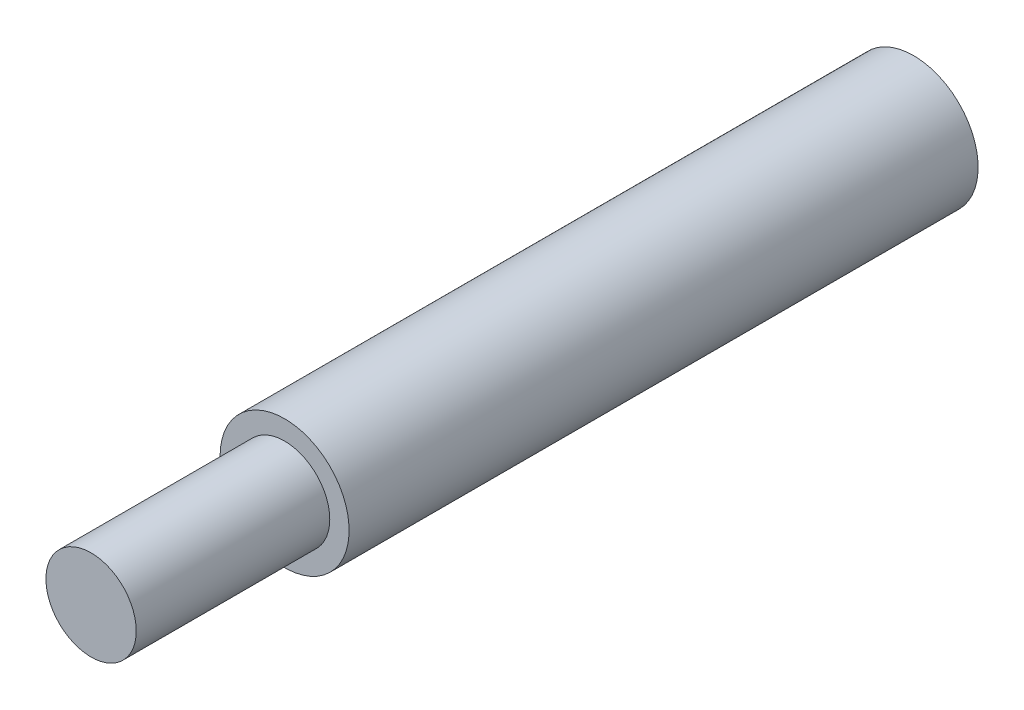
ISO-10303-21;
HEADER;
FILE_DESCRIPTION(('STEP AP214'),'2;1');
FILE_NAME('part.step','',(''),(''),'','','');
FILE_SCHEMA(('AUTOMOTIVE_DESIGN { 1 0 10303 214 1 1 1 1 }'));
ENDSEC;
DATA;
#1=APPLICATION_CONTEXT('core data for automotive mechanical design processes');
#2=APPLICATION_PROTOCOL_DEFINITION('international standard','automotive_design',2000,#1);
#3=PRODUCT_CONTEXT('',#1,'mechanical');
#4=PRODUCT('Part','Part','',(#3));
#5=PRODUCT_RELATED_PRODUCT_CATEGORY('part','',(#4));
#6=PRODUCT_DEFINITION_FORMATION('','',#4);
#7=PRODUCT_DEFINITION_CONTEXT('part definition',#1,'design');
#8=PRODUCT_DEFINITION('design','',#6,#7);
#9=PRODUCT_DEFINITION_SHAPE('','',#8);
#10=(LENGTH_UNIT() NAMED_UNIT(*) SI_UNIT(.MILLI.,.METRE.));
#11=(NAMED_UNIT(*) PLANE_ANGLE_UNIT() SI_UNIT($,.RADIAN.));
#12=(NAMED_UNIT(*) SI_UNIT($,.STERADIAN.) SOLID_ANGLE_UNIT());
#13=UNCERTAINTY_MEASURE_WITH_UNIT(LENGTH_MEASURE(1.E-05),#10,'distance_accuracy_value','');
#14=(GEOMETRIC_REPRESENTATION_CONTEXT(3) GLOBAL_UNCERTAINTY_ASSIGNED_CONTEXT((#13)) GLOBAL_UNIT_ASSIGNED_CONTEXT((#10,
#11,#12)) REPRESENTATION_CONTEXT('',''));
#15=CARTESIAN_POINT('',(0.,0.,0.));
#16=DIRECTION('',(0.,0.,1.));
#17=DIRECTION('',(1.,0.,0.));
#18=AXIS2_PLACEMENT_3D('',#15,#16,#17);
#19=CARTESIAN_POINT('',(0.,0.,6.));
#20=DIRECTION('',(0.,0.,-1.));
#21=DIRECTION('',(-1.,0.,0.));
#22=AXIS2_PLACEMENT_3D('',#19,#20,#21);
#23=CYLINDRICAL_SURFACE('',#22,1.4);
#24=CARTESIAN_POINT('',(0.,0.,6.));
#25=DIRECTION('',(0.,0.,1.));
#26=DIRECTION('',(1.,0.,0.));
#27=AXIS2_PLACEMENT_3D('',#24,#25,#26);
#28=CIRCLE('',#27,1.4);
#29=CARTESIAN_POINT('',(1.4,0.,6.));
#30=VERTEX_POINT('',#29);
#31=EDGE_CURVE('E10',#30,#30,#28,.T.);
#32=ORIENTED_EDGE('',*,*,#31,.F.);
#33=EDGE_LOOP('',(#32));
#34=FACE_BOUND('',#33,.T.);
#35=CARTESIAN_POINT('',(0.,0.,0.));
#36=DIRECTION('',(0.,0.,1.));
#37=DIRECTION('',(1.,0.,0.));
#38=AXIS2_PLACEMENT_3D('',#35,#36,#37);
#39=CIRCLE('',#38,1.4);
#40=CARTESIAN_POINT('',(1.4,0.,0.));
#41=VERTEX_POINT('',#40);
#42=EDGE_CURVE('E37',#41,#41,#39,.T.);
#43=ORIENTED_EDGE('',*,*,#42,.T.);
#44=EDGE_LOOP('',(#43));
#45=FACE_BOUND('',#44,.T.);
#46=ADVANCED_FACE('F34',(#34,#45),#23,.T.);
#47=CARTESIAN_POINT('',(0.,0.,6.));
#48=DIRECTION('',(0.,0.,1.));
#49=DIRECTION('',(1.,0.,0.));
#50=AXIS2_PLACEMENT_3D('',#47,#48,#49);
#51=PLANE('',#50);
#52=ORIENTED_EDGE('',*,*,#31,.T.);
#53=EDGE_LOOP('',(#52));
#54=FACE_BOUND('',#53,.T.);
#55=ADVANCED_FACE('F76',(#54),#51,.T.);
#56=CARTESIAN_POINT('',(0.,0.,-19.5));
#57=DIRECTION('',(0.,0.,1.));
#58=DIRECTION('',(1.,0.,0.));
#59=AXIS2_PLACEMENT_3D('',#56,#57,#58);
#60=CYLINDRICAL_SURFACE('',#59,2.);
#61=CARTESIAN_POINT('',(0.,0.,-19.5));
#62=DIRECTION('',(0.,0.,-1.));
#63=DIRECTION('',(-1.,0.,0.));
#64=AXIS2_PLACEMENT_3D('',#61,#62,#63);
#65=CIRCLE('',#64,2.);
#66=CARTESIAN_POINT('',(-2.,0.,-19.5));
#67=VERTEX_POINT('',#66);
#68=EDGE_CURVE('E44',#67,#67,#65,.T.);
#69=ORIENTED_EDGE('',*,*,#68,.F.);
#70=EDGE_LOOP('',(#69));
#71=FACE_BOUND('',#70,.T.);
#72=CARTESIAN_POINT('',(0.,0.,0.));
#73=DIRECTION('',(0.,0.,-1.));
#74=DIRECTION('',(-1.,0.,0.));
#75=AXIS2_PLACEMENT_3D('',#72,#73,#74);
#76=CIRCLE('',#75,2.);
#77=CARTESIAN_POINT('',(-2.,0.,0.));
#78=VERTEX_POINT('',#77);
#79=EDGE_CURVE('E46',#78,#78,#76,.T.);
#80=ORIENTED_EDGE('',*,*,#79,.T.);
#81=EDGE_LOOP('',(#80));
#82=FACE_BOUND('',#81,.T.);
#83=ADVANCED_FACE('F70',(#71,#82),#60,.T.);
#84=CARTESIAN_POINT('',(0.,0.,-19.5));
#85=DIRECTION('',(0.,0.,-1.));
#86=DIRECTION('',(-1.,0.,0.));
#87=AXIS2_PLACEMENT_3D('',#84,#85,#86);
#88=PLANE('',#87);
#89=CARTESIAN_POINT('',(0.,0.,-19.5));
#90=DIRECTION('',(0.,0.,-1.));
#91=DIRECTION('',(-1.,0.,0.));
#92=AXIS2_PLACEMENT_3D('',#89,#90,#91);
#93=CIRCLE('',#92,1.4);
#94=CARTESIAN_POINT('',(-1.4,0.,-19.5));
#95=VERTEX_POINT('',#94);
#96=EDGE_CURVE('E52',#95,#95,#93,.T.);
#97=ORIENTED_EDGE('',*,*,#96,.F.);
#98=EDGE_LOOP('',(#97));
#99=FACE_BOUND('',#98,.T.);
#100=ORIENTED_EDGE('',*,*,#68,.T.);
#101=EDGE_LOOP('',(#100));
#102=FACE_BOUND('',#101,.T.);
#103=ADVANCED_FACE('F67',(#99,#102),#88,.T.);
#104=CARTESIAN_POINT('',(0.,0.,0.));
#105=DIRECTION('',(0.,0.,-1.));
#106=DIRECTION('',(-1.,0.,0.));
#107=AXIS2_PLACEMENT_3D('',#104,#105,#106);
#108=PLANE('',#107);
#109=ORIENTED_EDGE('',*,*,#42,.F.);
#110=EDGE_LOOP('',(#109));
#111=FACE_BOUND('',#110,.T.);
#112=ORIENTED_EDGE('',*,*,#79,.F.);
#113=EDGE_LOOP('',(#112));
#114=FACE_BOUND('',#113,.T.);
#115=ADVANCED_FACE('F63',(#111,#114),#108,.F.);
#116=CARTESIAN_POINT('',(0.,0.,-9.5));
#117=DIRECTION('',(0.,0.,-1.));
#118=DIRECTION('',(-1.,0.,0.));
#119=AXIS2_PLACEMENT_3D('',#116,#117,#118);
#120=CYLINDRICAL_SURFACE('',#119,1.4);
#121=CARTESIAN_POINT('',(0.,0.,-9.5));
#122=DIRECTION('',(0.,0.,-1.));
#123=DIRECTION('',(-1.,0.,0.));
#124=AXIS2_PLACEMENT_3D('',#121,#122,#123);
#125=CIRCLE('',#124,1.4);
#126=CARTESIAN_POINT('',(-1.4,0.,-9.5));
#127=VERTEX_POINT('',#126);
#128=EDGE_CURVE('E49',#127,#127,#125,.T.);
#129=ORIENTED_EDGE('',*,*,#128,.F.);
#130=EDGE_LOOP('',(#129));
#131=FACE_BOUND('',#130,.T.);
#132=ORIENTED_EDGE('',*,*,#96,.T.);
#133=EDGE_LOOP('',(#132));
#134=FACE_BOUND('',#133,.T.);
#135=ADVANCED_FACE('F60',(#131,#134),#120,.F.);
#136=CARTESIAN_POINT('',(0.,0.,-9.5));
#137=DIRECTION('',(0.,0.,-1.));
#138=DIRECTION('',(-1.,0.,0.));
#139=AXIS2_PLACEMENT_3D('',#136,#137,#138);
#140=PLANE('',#139);
#141=ORIENTED_EDGE('',*,*,#128,.T.);
#142=EDGE_LOOP('',(#141));
#143=FACE_BOUND('',#142,.T.);
#144=ADVANCED_FACE('F58',(#143),#140,.T.);
#145=CLOSED_SHELL('',(#46,#55,#83,#103,#115,#135,#144));
#146=MANIFOLD_SOLID_BREP('B2',#145);
#147=ADVANCED_BREP_SHAPE_REPRESENTATION('',(#18,#146),#14);
#148=SHAPE_DEFINITION_REPRESENTATION(#9,#147);
ENDSEC;
END-ISO-10303-21;
